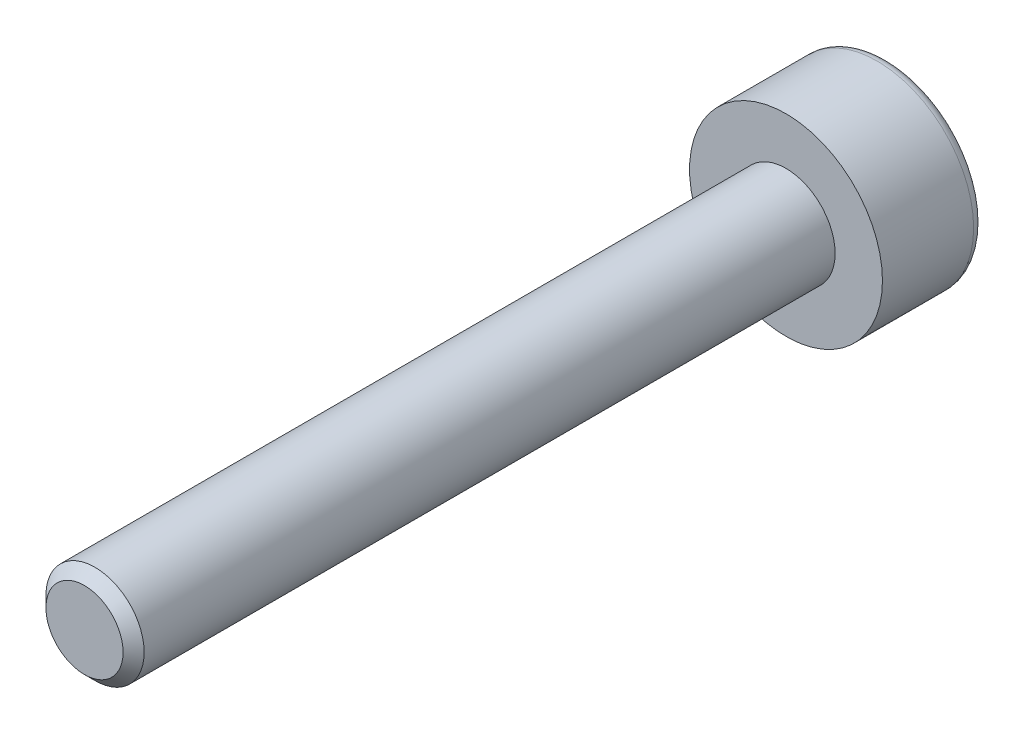
ISO-10303-21;
HEADER;
FILE_DESCRIPTION(('STEP AP214'),'2;1');
FILE_NAME('part.step','',(''),(''),'','','');
FILE_SCHEMA(('AUTOMOTIVE_DESIGN { 1 0 10303 214 1 1 1 1 }'));
ENDSEC;
DATA;
#1=APPLICATION_CONTEXT('core data for automotive mechanical design processes');
#2=APPLICATION_PROTOCOL_DEFINITION('international standard','automotive_design',2000,#1);
#3=PRODUCT_CONTEXT('',#1,'mechanical');
#4=PRODUCT('Part','Part','',(#3));
#5=PRODUCT_RELATED_PRODUCT_CATEGORY('part','',(#4));
#6=PRODUCT_DEFINITION_FORMATION('','',#4);
#7=PRODUCT_DEFINITION_CONTEXT('part definition',#1,'design');
#8=PRODUCT_DEFINITION('design','',#6,#7);
#9=PRODUCT_DEFINITION_SHAPE('','',#8);
#10=(LENGTH_UNIT() NAMED_UNIT(*) SI_UNIT(.MILLI.,.METRE.));
#11=(NAMED_UNIT(*) PLANE_ANGLE_UNIT() SI_UNIT($,.RADIAN.));
#12=(NAMED_UNIT(*) SI_UNIT($,.STERADIAN.) SOLID_ANGLE_UNIT());
#13=UNCERTAINTY_MEASURE_WITH_UNIT(LENGTH_MEASURE(1.E-05),#10,'distance_accuracy_value','');
#14=(GEOMETRIC_REPRESENTATION_CONTEXT(3) GLOBAL_UNCERTAINTY_ASSIGNED_CONTEXT((#13)) GLOBAL_UNIT_ASSIGNED_CONTEXT((#10,
#11,#12)) REPRESENTATION_CONTEXT('',''));
#15=CARTESIAN_POINT('',(0.,0.,0.));
#16=DIRECTION('',(0.,0.,1.));
#17=DIRECTION('',(1.,0.,0.));
#18=AXIS2_PLACEMENT_3D('',#15,#16,#17);
#19=CARTESIAN_POINT('',(0.,0.,2.9));
#20=DIRECTION('',(0.,0.,1.));
#21=DIRECTION('',(1.,0.,0.));
#22=AXIS2_PLACEMENT_3D('',#19,#20,#21);
#23=PLANE('',#22);
#24=CARTESIAN_POINT('',(0.,0.,2.9));
#25=DIRECTION('',(0.,0.,1.));
#26=DIRECTION('',(1.,0.,0.));
#27=AXIS2_PLACEMENT_3D('',#24,#25,#26);
#28=CIRCLE('',#27,2.75);
#29=CARTESIAN_POINT('',(2.75,0.,2.9));
#30=VERTEX_POINT('',#29);
#31=EDGE_CURVE('E126',#30,#30,#28,.T.);
#32=ORIENTED_EDGE('',*,*,#31,.T.);
#33=EDGE_LOOP('',(#32));
#34=FACE_BOUND('',#33,.T.);
#35=CARTESIAN_POINT('',(0.,0.,2.9));
#36=DIRECTION('',(0.,0.,1.));
#37=DIRECTION('',(1.,0.,0.));
#38=AXIS2_PLACEMENT_3D('',#35,#36,#37);
#39=CIRCLE('',#38,1.4);
#40=CARTESIAN_POINT('',(1.4,0.,2.9));
#41=VERTEX_POINT('',#40);
#42=EDGE_CURVE('E118',#41,#41,#39,.T.);
#43=ORIENTED_EDGE('',*,*,#42,.F.);
#44=EDGE_LOOP('',(#43));
#45=FACE_BOUND('',#44,.T.);
#46=ADVANCED_FACE('F17',(#34,#45),#23,.T.);
#47=CARTESIAN_POINT('',(0.,0.,2.9));
#48=DIRECTION('',(0.,0.,-1.));
#49=DIRECTION('',(-1.,0.,0.));
#50=AXIS2_PLACEMENT_3D('',#47,#48,#49);
#51=CYLINDRICAL_SURFACE('',#50,2.75);
#52=CARTESIAN_POINT('',(0.,0.,0.3));
#53=DIRECTION('',(0.,0.,1.));
#54=DIRECTION('',(1.,0.,0.));
#55=AXIS2_PLACEMENT_3D('',#52,#53,#54);
#56=CIRCLE('',#55,2.75);
#57=CARTESIAN_POINT('',(2.75,0.,0.3));
#58=VERTEX_POINT('',#57);
#59=EDGE_CURVE('E25',#58,#58,#56,.T.);
#60=ORIENTED_EDGE('',*,*,#59,.T.);
#61=EDGE_LOOP('',(#60));
#62=FACE_BOUND('',#61,.T.);
#63=ORIENTED_EDGE('',*,*,#31,.F.);
#64=EDGE_LOOP('',(#63));
#65=FACE_BOUND('',#64,.T.);
#66=ADVANCED_FACE('F139',(#62,#65),#51,.T.);
#67=CARTESIAN_POINT('',(0.,0.,0.));
#68=DIRECTION('',(0.,0.,1.));
#69=DIRECTION('',(1.,0.,0.));
#70=AXIS2_PLACEMENT_3D('',#67,#68,#69);
#71=PLANE('',#70);
#72=CARTESIAN_POINT('',(0.,0.,0.));
#73=DIRECTION('',(0.,0.,1.));
#74=DIRECTION('',(1.,0.,0.));
#75=AXIS2_PLACEMENT_3D('',#72,#73,#74);
#76=CIRCLE('',#75,2.45);
#77=CARTESIAN_POINT('',(2.45,0.,0.));
#78=VERTEX_POINT('',#77);
#79=EDGE_CURVE('E11',#78,#78,#76,.F.);
#80=ORIENTED_EDGE('',*,*,#79,.T.);
#81=EDGE_LOOP('',(#80));
#82=FACE_BOUND('',#81,.T.);
#83=DIRECTION('',(0.866025403784439,-0.5,0.));
#84=VECTOR('',#83,1.);
#85=CARTESIAN_POINT('',(0.,1.4,0.));
#86=LINE('',#85,#84);
#87=CARTESIAN_POINT('',(0.,1.4,0.));
#88=VERTEX_POINT('',#87);
#89=CARTESIAN_POINT('',(1.21243556529821,0.7,0.));
#90=VERTEX_POINT('',#89);
#91=EDGE_CURVE('E106',#88,#90,#86,.T.);
#92=ORIENTED_EDGE('',*,*,#91,.F.);
#93=DIRECTION('',(0.866025403784439,0.5,0.));
#94=VECTOR('',#93,1.);
#95=CARTESIAN_POINT('',(-1.21243556529821,0.7,0.));
#96=LINE('',#95,#94);
#97=CARTESIAN_POINT('',(-1.21243556529821,0.7,0.));
#98=VERTEX_POINT('',#97);
#99=EDGE_CURVE('E32',#98,#88,#96,.T.);
#100=ORIENTED_EDGE('',*,*,#99,.F.);
#101=DIRECTION('',(0.,1.,0.));
#102=VECTOR('',#101,1.);
#103=CARTESIAN_POINT('',(-1.21243556529821,-0.7,0.));
#104=LINE('',#103,#102);
#105=CARTESIAN_POINT('',(-1.21243556529821,-0.7,0.));
#106=VERTEX_POINT('',#105);
#107=EDGE_CURVE('E113',#106,#98,#104,.T.);
#108=ORIENTED_EDGE('',*,*,#107,.F.);
#109=DIRECTION('',(-0.866025403784439,0.5,0.));
#110=VECTOR('',#109,1.);
#111=CARTESIAN_POINT('',(0.,-1.4,0.));
#112=LINE('',#111,#110);
#113=CARTESIAN_POINT('',(0.,-1.4,0.));
#114=VERTEX_POINT('',#113);
#115=EDGE_CURVE('E114',#114,#106,#112,.T.);
#116=ORIENTED_EDGE('',*,*,#115,.F.);
#117=DIRECTION('',(-0.866025403784439,-0.5,0.));
#118=VECTOR('',#117,1.);
#119=CARTESIAN_POINT('',(1.21243556529821,-0.7,0.));
#120=LINE('',#119,#118);
#121=CARTESIAN_POINT('',(1.21243556529821,-0.7,0.));
#122=VERTEX_POINT('',#121);
#123=EDGE_CURVE('E79',#122,#114,#120,.T.);
#124=ORIENTED_EDGE('',*,*,#123,.F.);
#125=DIRECTION('',(0.,-1.,0.));
#126=VECTOR('',#125,1.);
#127=CARTESIAN_POINT('',(1.21243556529821,0.7,0.));
#128=LINE('',#127,#126);
#129=EDGE_CURVE('E108',#90,#122,#128,.T.);
#130=ORIENTED_EDGE('',*,*,#129,.F.);
#131=EDGE_LOOP('',(#92,#100,#108,#116,#124,#130));
#132=FACE_BOUND('',#131,.T.);
#133=ADVANCED_FACE('F158',(#82,#132),#71,.F.);
#134=CARTESIAN_POINT('',(0.,0.,22.9));
#135=DIRECTION('',(0.,0.,-1.));
#136=DIRECTION('',(-1.,0.,0.));
#137=AXIS2_PLACEMENT_3D('',#134,#135,#136);
#138=CYLINDRICAL_SURFACE('',#137,1.4);
#139=CARTESIAN_POINT('',(0.,0.,22.6));
#140=DIRECTION('',(0.,0.,1.));
#141=DIRECTION('',(1.,0.,0.));
#142=AXIS2_PLACEMENT_3D('',#139,#140,#141);
#143=CIRCLE('',#142,1.4);
#144=CARTESIAN_POINT('',(1.4,0.,22.6));
#145=VERTEX_POINT('',#144);
#146=EDGE_CURVE('E132',#145,#145,#143,.F.);
#147=ORIENTED_EDGE('',*,*,#146,.T.);
#148=EDGE_LOOP('',(#147));
#149=FACE_BOUND('',#148,.T.);
#150=ORIENTED_EDGE('',*,*,#42,.T.);
#151=EDGE_LOOP('',(#150));
#152=FACE_BOUND('',#151,.T.);
#153=ADVANCED_FACE('F162',(#149,#152),#138,.T.);
#154=CARTESIAN_POINT('',(0.,0.,22.9));
#155=DIRECTION('',(0.,0.,1.));
#156=DIRECTION('',(1.,0.,0.));
#157=AXIS2_PLACEMENT_3D('',#154,#155,#156);
#158=PLANE('',#157);
#159=CARTESIAN_POINT('',(0.,0.,22.9));
#160=DIRECTION('',(0.,0.,1.));
#161=DIRECTION('',(1.,0.,0.));
#162=AXIS2_PLACEMENT_3D('',#159,#160,#161);
#163=CIRCLE('',#162,1.1);
#164=CARTESIAN_POINT('',(1.1,0.,22.9));
#165=VERTEX_POINT('',#164);
#166=EDGE_CURVE('E129',#165,#165,#163,.T.);
#167=ORIENTED_EDGE('',*,*,#166,.T.);
#168=EDGE_LOOP('',(#167));
#169=FACE_BOUND('',#168,.T.);
#170=ADVANCED_FACE('F168',(#169),#158,.T.);
#171=CARTESIAN_POINT('',(0.,0.,22.9));
#172=DIRECTION('',(0.,0.,-1.));
#173=DIRECTION('',(-1.,0.,0.));
#174=AXIS2_PLACEMENT_3D('',#171,#172,#173);
#175=CONICAL_SURFACE('',#174,1.1,0.785398163397445);
#176=ORIENTED_EDGE('',*,*,#146,.F.);
#177=EDGE_LOOP('',(#176));
#178=FACE_BOUND('',#177,.T.);
#179=ORIENTED_EDGE('',*,*,#166,.F.);
#180=EDGE_LOOP('',(#179));
#181=FACE_BOUND('',#180,.T.);
#182=ADVANCED_FACE('F170',(#178,#181),#175,.T.);
#183=CARTESIAN_POINT('',(-1.21243556529821,0.7,1.8));
#184=DIRECTION('',(-0.5,0.866025403784439,0.));
#185=DIRECTION('',(-0.866025403784439,-0.5,0.));
#186=AXIS2_PLACEMENT_3D('',#183,#184,#185);
#187=PLANE('',#186);
#188=ORIENTED_EDGE('',*,*,#99,.T.);
#189=DIRECTION('',(0.,0.,-1.));
#190=VECTOR('',#189,1.);
#191=CARTESIAN_POINT('',(0.,1.4,1.8));
#192=LINE('',#191,#190);
#193=CARTESIAN_POINT('',(0.,1.4,1.8));
#194=VERTEX_POINT('',#193);
#195=EDGE_CURVE('E62',#194,#88,#192,.T.);
#196=ORIENTED_EDGE('',*,*,#195,.F.);
#197=DIRECTION('',(0.866025403784439,0.5,0.));
#198=VECTOR('',#197,1.);
#199=CARTESIAN_POINT('',(-1.21243556529821,0.7,1.8));
#200=LINE('',#199,#198);
#201=CARTESIAN_POINT('',(-1.21243556529821,0.7,1.8));
#202=VERTEX_POINT('',#201);
#203=EDGE_CURVE('E117',#202,#194,#200,.T.);
#204=ORIENTED_EDGE('',*,*,#203,.F.);
#205=DIRECTION('',(0.,0.,-1.));
#206=VECTOR('',#205,1.);
#207=CARTESIAN_POINT('',(-1.21243556529821,0.7,1.8));
#208=LINE('',#207,#206);
#209=EDGE_CURVE('E37',#202,#98,#208,.T.);
#210=ORIENTED_EDGE('',*,*,#209,.T.);
#211=EDGE_LOOP('',(#188,#196,#204,#210));
#212=FACE_BOUND('',#211,.T.);
#213=ADVANCED_FACE('F166',(#212),#187,.F.);
#214=CARTESIAN_POINT('',(-1.21243556529821,-0.7,1.8));
#215=DIRECTION('',(-1.,0.,0.));
#216=DIRECTION('',(0.,-1.,0.));
#217=AXIS2_PLACEMENT_3D('',#214,#215,#216);
#218=PLANE('',#217);
#219=ORIENTED_EDGE('',*,*,#107,.T.);
#220=ORIENTED_EDGE('',*,*,#209,.F.);
#221=DIRECTION('',(0.,1.,0.));
#222=VECTOR('',#221,1.);
#223=CARTESIAN_POINT('',(-1.21243556529821,-0.7,1.8));
#224=LINE('',#223,#222);
#225=CARTESIAN_POINT('',(-1.21243556529821,-0.7,1.8));
#226=VERTEX_POINT('',#225);
#227=EDGE_CURVE('E95',#226,#202,#224,.T.);
#228=ORIENTED_EDGE('',*,*,#227,.F.);
#229=DIRECTION('',(0.,0.,-1.));
#230=VECTOR('',#229,1.);
#231=CARTESIAN_POINT('',(-1.21243556529821,-0.7,1.8));
#232=LINE('',#231,#230);
#233=EDGE_CURVE('E81',#226,#106,#232,.T.);
#234=ORIENTED_EDGE('',*,*,#233,.T.);
#235=EDGE_LOOP('',(#219,#220,#228,#234));
#236=FACE_BOUND('',#235,.T.);
#237=ADVANCED_FACE('F179',(#236),#218,.F.);
#238=CARTESIAN_POINT('',(0.,-1.4,1.8));
#239=DIRECTION('',(-0.5,-0.866025403784439,0.));
#240=DIRECTION('',(0.866025403784439,-0.5,0.));
#241=AXIS2_PLACEMENT_3D('',#238,#239,#240);
#242=PLANE('',#241);
#243=ORIENTED_EDGE('',*,*,#115,.T.);
#244=ORIENTED_EDGE('',*,*,#233,.F.);
#245=DIRECTION('',(-0.866025403784439,0.5,0.));
#246=VECTOR('',#245,1.);
#247=CARTESIAN_POINT('',(0.,-1.4,1.8));
#248=LINE('',#247,#246);
#249=CARTESIAN_POINT('',(0.,-1.4,1.8));
#250=VERTEX_POINT('',#249);
#251=EDGE_CURVE('E86',#250,#226,#248,.T.);
#252=ORIENTED_EDGE('',*,*,#251,.F.);
#253=DIRECTION('',(0.,0.,-1.));
#254=VECTOR('',#253,1.);
#255=CARTESIAN_POINT('',(0.,-1.4,1.8));
#256=LINE('',#255,#254);
#257=EDGE_CURVE('E73',#250,#114,#256,.T.);
#258=ORIENTED_EDGE('',*,*,#257,.T.);
#259=EDGE_LOOP('',(#243,#244,#252,#258));
#260=FACE_BOUND('',#259,.T.);
#261=ADVANCED_FACE('F90',(#260),#242,.F.);
#262=CARTESIAN_POINT('',(1.21243556529821,-0.7,1.8));
#263=DIRECTION('',(0.5,-0.866025403784439,0.));
#264=DIRECTION('',(0.866025403784439,0.5,0.));
#265=AXIS2_PLACEMENT_3D('',#262,#263,#264);
#266=PLANE('',#265);
#267=ORIENTED_EDGE('',*,*,#123,.T.);
#268=ORIENTED_EDGE('',*,*,#257,.F.);
#269=DIRECTION('',(-0.866025403784439,-0.5,0.));
#270=VECTOR('',#269,1.);
#271=CARTESIAN_POINT('',(1.21243556529821,-0.7,1.8));
#272=LINE('',#271,#270);
#273=CARTESIAN_POINT('',(1.21243556529821,-0.7,1.8));
#274=VERTEX_POINT('',#273);
#275=EDGE_CURVE('E80',#274,#250,#272,.T.);
#276=ORIENTED_EDGE('',*,*,#275,.F.);
#277=DIRECTION('',(0.,0.,-1.));
#278=VECTOR('',#277,1.);
#279=CARTESIAN_POINT('',(1.21243556529821,-0.7,1.8));
#280=LINE('',#279,#278);
#281=EDGE_CURVE('E83',#274,#122,#280,.T.);
#282=ORIENTED_EDGE('',*,*,#281,.T.);
#283=EDGE_LOOP('',(#267,#268,#276,#282));
#284=FACE_BOUND('',#283,.T.);
#285=ADVANCED_FACE('F74',(#284),#266,.F.);
#286=CARTESIAN_POINT('',(1.21243556529821,0.7,1.8));
#287=DIRECTION('',(1.,0.,0.));
#288=DIRECTION('',(0.,1.,0.));
#289=AXIS2_PLACEMENT_3D('',#286,#287,#288);
#290=PLANE('',#289);
#291=ORIENTED_EDGE('',*,*,#129,.T.);
#292=ORIENTED_EDGE('',*,*,#281,.F.);
#293=DIRECTION('',(0.,-1.,0.));
#294=VECTOR('',#293,1.);
#295=CARTESIAN_POINT('',(1.21243556529821,0.7,1.8));
#296=LINE('',#295,#294);
#297=CARTESIAN_POINT('',(1.21243556529821,0.7,1.8));
#298=VERTEX_POINT('',#297);
#299=EDGE_CURVE('E98',#298,#274,#296,.T.);
#300=ORIENTED_EDGE('',*,*,#299,.F.);
#301=DIRECTION('',(0.,0.,-1.));
#302=VECTOR('',#301,1.);
#303=CARTESIAN_POINT('',(1.21243556529821,0.7,1.8));
#304=LINE('',#303,#302);
#305=EDGE_CURVE('E124',#298,#90,#304,.T.);
#306=ORIENTED_EDGE('',*,*,#305,.T.);
#307=EDGE_LOOP('',(#291,#292,#300,#306));
#308=FACE_BOUND('',#307,.T.);
#309=ADVANCED_FACE('F226',(#308),#290,.F.);
#310=CARTESIAN_POINT('',(0.,1.4,1.8));
#311=DIRECTION('',(0.5,0.866025403784439,0.));
#312=DIRECTION('',(-0.866025403784439,0.5,0.));
#313=AXIS2_PLACEMENT_3D('',#310,#311,#312);
#314=PLANE('',#313);
#315=ORIENTED_EDGE('',*,*,#91,.T.);
#316=ORIENTED_EDGE('',*,*,#305,.F.);
#317=DIRECTION('',(0.866025403784439,-0.5,0.));
#318=VECTOR('',#317,1.);
#319=CARTESIAN_POINT('',(0.,1.4,1.8));
#320=LINE('',#319,#318);
#321=EDGE_CURVE('E99',#194,#298,#320,.T.);
#322=ORIENTED_EDGE('',*,*,#321,.F.);
#323=ORIENTED_EDGE('',*,*,#195,.T.);
#324=EDGE_LOOP('',(#315,#316,#322,#323));
#325=FACE_BOUND('',#324,.T.);
#326=ADVANCED_FACE('F146',(#325),#314,.F.);
#327=CARTESIAN_POINT('',(0.,0.,1.8));
#328=DIRECTION('',(0.,0.,-1.));
#329=DIRECTION('',(-1.,0.,0.));
#330=AXIS2_PLACEMENT_3D('',#327,#328,#329);
#331=PLANE('',#330);
#332=ORIENTED_EDGE('',*,*,#203,.T.);
#333=ORIENTED_EDGE('',*,*,#321,.T.);
#334=ORIENTED_EDGE('',*,*,#299,.T.);
#335=ORIENTED_EDGE('',*,*,#275,.T.);
#336=ORIENTED_EDGE('',*,*,#251,.T.);
#337=ORIENTED_EDGE('',*,*,#227,.T.);
#338=EDGE_LOOP('',(#332,#333,#334,#335,#336,#337));
#339=FACE_BOUND('',#338,.T.);
#340=ADVANCED_FACE('F92',(#339),#331,.T.);
#341=CARTESIAN_POINT('',(0.,0.,0.3));
#342=DIRECTION('',(0.,0.,1.));
#343=DIRECTION('',(1.,0.,0.));
#344=AXIS2_PLACEMENT_3D('',#341,#342,#343);
#345=TOROIDAL_SURFACE('',#344,2.45,0.3);
#346=ORIENTED_EDGE('',*,*,#79,.F.);
#347=EDGE_LOOP('',(#346));
#348=FACE_BOUND('',#347,.T.);
#349=ORIENTED_EDGE('',*,*,#59,.F.);
#350=EDGE_LOOP('',(#349));
#351=FACE_BOUND('',#350,.T.);
#352=ADVANCED_FACE('F19',(#348,#351),#345,.T.);
#353=CLOSED_SHELL('',(#46,#66,#133,#153,#170,#182,#213,#237,#261,#285,#309,#326,#340,#352));
#354=MANIFOLD_SOLID_BREP('B1',#353);
#355=ADVANCED_BREP_SHAPE_REPRESENTATION('',(#18,#354),#14);
#356=SHAPE_DEFINITION_REPRESENTATION(#9,#355);
ENDSEC;
END-ISO-10303-21;
